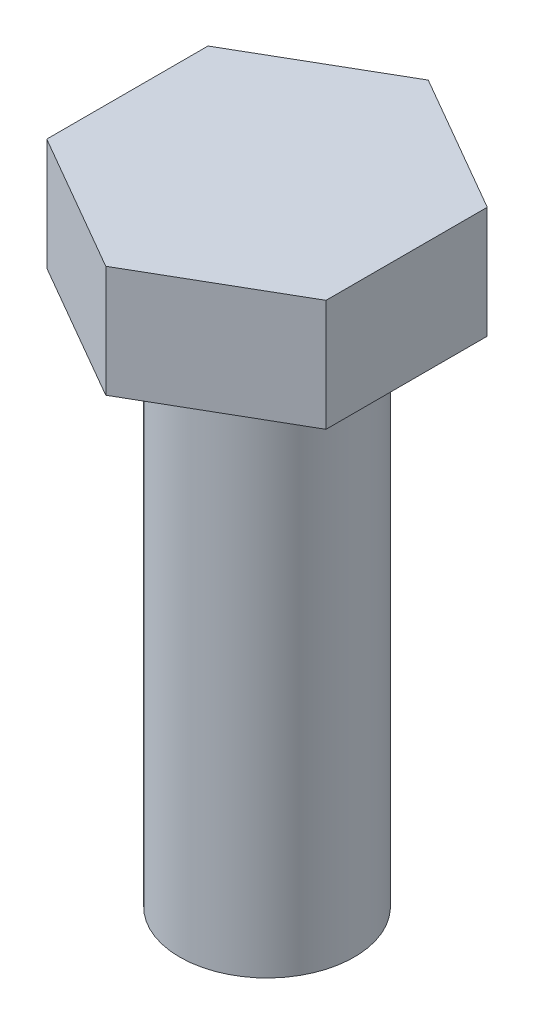
ISO-10303-21;
HEADER;
FILE_DESCRIPTION(('STEP AP214'),'2;1');
FILE_NAME('part.step','',(''),(''),'','','');
FILE_SCHEMA(('AUTOMOTIVE_DESIGN { 1 0 10303 214 1 1 1 1 }'));
ENDSEC;
DATA;
#1=APPLICATION_CONTEXT('core data for automotive mechanical design processes');
#2=APPLICATION_PROTOCOL_DEFINITION('international standard','automotive_design',2000,#1);
#3=PRODUCT_CONTEXT('',#1,'mechanical');
#4=PRODUCT('Part','Part','',(#3));
#5=PRODUCT_RELATED_PRODUCT_CATEGORY('part','',(#4));
#6=PRODUCT_DEFINITION_FORMATION('','',#4);
#7=PRODUCT_DEFINITION_CONTEXT('part definition',#1,'design');
#8=PRODUCT_DEFINITION('design','',#6,#7);
#9=PRODUCT_DEFINITION_SHAPE('','',#8);
#10=(LENGTH_UNIT() NAMED_UNIT(*) SI_UNIT(.MILLI.,.METRE.));
#11=(NAMED_UNIT(*) PLANE_ANGLE_UNIT() SI_UNIT($,.RADIAN.));
#12=(NAMED_UNIT(*) SI_UNIT($,.STERADIAN.) SOLID_ANGLE_UNIT());
#13=UNCERTAINTY_MEASURE_WITH_UNIT(LENGTH_MEASURE(1.E-05),#10,'distance_accuracy_value','');
#14=(GEOMETRIC_REPRESENTATION_CONTEXT(3) GLOBAL_UNCERTAINTY_ASSIGNED_CONTEXT((#13)) GLOBAL_UNIT_ASSIGNED_CONTEXT((#10,
#11,#12)) REPRESENTATION_CONTEXT('',''));
#15=CARTESIAN_POINT('',(0.,0.,0.));
#16=DIRECTION('',(0.,0.,1.));
#17=DIRECTION('',(1.,0.,0.));
#18=AXIS2_PLACEMENT_3D('',#15,#16,#17);
#19=CARTESIAN_POINT('',(7.99999999999995,6.4,-4.6188021535171));
#20=DIRECTION('',(-0.499999999999995,0.,0.866025403784441));
#21=DIRECTION('',(0.866025403784441,0.,0.499999999999995));
#22=AXIS2_PLACEMENT_3D('',#19,#20,#21);
#23=PLANE('',#22);
#24=DIRECTION('',(-0.866025403784441,0.,-0.499999999999995));
#25=VECTOR('',#24,1.);
#26=CARTESIAN_POINT('',(7.99999999999995,0.,-4.6188021535171));
#27=LINE('',#26,#25);
#28=CARTESIAN_POINT('',(7.99999999999995,0.,-4.6188021535171));
#29=VERTEX_POINT('',#28);
#30=CARTESIAN_POINT('',(0.,0.,-9.23760430703401));
#31=VERTEX_POINT('',#30);
#32=EDGE_CURVE('E121',#29,#31,#27,.T.);
#33=ORIENTED_EDGE('',*,*,#32,.T.);
#34=DIRECTION('',(0.,-1.,0.));
#35=VECTOR('',#34,1.);
#36=CARTESIAN_POINT('',(0.,6.4,-9.23760430703401));
#37=LINE('',#36,#35);
#38=CARTESIAN_POINT('',(0.,6.4,-9.23760430703401));
#39=VERTEX_POINT('',#38);
#40=EDGE_CURVE('E11',#39,#31,#37,.T.);
#41=ORIENTED_EDGE('',*,*,#40,.F.);
#42=DIRECTION('',(-0.866025403784441,0.,-0.499999999999995));
#43=VECTOR('',#42,1.);
#44=CARTESIAN_POINT('',(7.99999999999995,6.4,-4.6188021535171));
#45=LINE('',#44,#43);
#46=CARTESIAN_POINT('',(7.99999999999995,6.4,-4.6188021535171));
#47=VERTEX_POINT('',#46);
#48=EDGE_CURVE('E132',#47,#39,#45,.T.);
#49=ORIENTED_EDGE('',*,*,#48,.F.);
#50=DIRECTION('',(0.,-1.,0.));
#51=VECTOR('',#50,1.);
#52=CARTESIAN_POINT('',(7.99999999999995,6.4,-4.6188021535171));
#53=LINE('',#52,#51);
#54=EDGE_CURVE('E117',#47,#29,#53,.T.);
#55=ORIENTED_EDGE('',*,*,#54,.T.);
#56=EDGE_LOOP('',(#33,#41,#49,#55));
#57=FACE_BOUND('',#56,.T.);
#58=ADVANCED_FACE('F39',(#57),#23,.F.);
#59=CARTESIAN_POINT('',(0.,6.4,-9.23760430703401));
#60=DIRECTION('',(0.500000000000001,0.,0.866025403784438));
#61=DIRECTION('',(0.866025403784438,0.,-0.500000000000001));
#62=AXIS2_PLACEMENT_3D('',#59,#60,#61);
#63=PLANE('',#62);
#64=DIRECTION('',(-0.866025403784438,0.,0.500000000000001));
#65=VECTOR('',#64,1.);
#66=CARTESIAN_POINT('',(0.,0.,-9.23760430703401));
#67=LINE('',#66,#65);
#68=CARTESIAN_POINT('',(-8.00000000000001,0.,-4.61880215351699));
#69=VERTEX_POINT('',#68);
#70=EDGE_CURVE('E128',#31,#69,#67,.T.);
#71=ORIENTED_EDGE('',*,*,#70,.T.);
#72=DIRECTION('',(0.,-1.,0.));
#73=VECTOR('',#72,1.);
#74=CARTESIAN_POINT('',(-8.00000000000001,6.4,-4.61880215351699));
#75=LINE('',#74,#73);
#76=CARTESIAN_POINT('',(-8.00000000000001,6.4,-4.61880215351699));
#77=VERTEX_POINT('',#76);
#78=EDGE_CURVE('E50',#77,#69,#75,.T.);
#79=ORIENTED_EDGE('',*,*,#78,.F.);
#80=DIRECTION('',(-0.866025403784438,0.,0.500000000000001));
#81=VECTOR('',#80,1.);
#82=CARTESIAN_POINT('',(0.,6.4,-9.23760430703401));
#83=LINE('',#82,#81);
#84=EDGE_CURVE('E95',#39,#77,#83,.T.);
#85=ORIENTED_EDGE('',*,*,#84,.F.);
#86=ORIENTED_EDGE('',*,*,#40,.T.);
#87=EDGE_LOOP('',(#71,#79,#85,#86));
#88=FACE_BOUND('',#87,.T.);
#89=ADVANCED_FACE('F156',(#88),#63,.F.);
#90=CARTESIAN_POINT('',(-8.00000000000001,6.4,-4.61880215351699));
#91=DIRECTION('',(1.,0.,0.));
#92=DIRECTION('',(0.,0.,-1.));
#93=AXIS2_PLACEMENT_3D('',#90,#91,#92);
#94=PLANE('',#93);
#95=DIRECTION('',(0.,0.,1.));
#96=VECTOR('',#95,1.);
#97=CARTESIAN_POINT('',(-8.00000000000001,0.,-4.61880215351699));
#98=LINE('',#97,#96);
#99=CARTESIAN_POINT('',(-7.99999999999998,0.,4.61880215351704));
#100=VERTEX_POINT('',#99);
#101=EDGE_CURVE('E129',#69,#100,#98,.T.);
#102=ORIENTED_EDGE('',*,*,#101,.T.);
#103=DIRECTION('',(0.,-1.,0.));
#104=VECTOR('',#103,1.);
#105=CARTESIAN_POINT('',(-7.99999999999998,6.4,4.61880215351704));
#106=LINE('',#105,#104);
#107=CARTESIAN_POINT('',(-7.99999999999998,6.4,4.61880215351704));
#108=VERTEX_POINT('',#107);
#109=EDGE_CURVE('E114',#108,#100,#106,.T.);
#110=ORIENTED_EDGE('',*,*,#109,.F.);
#111=DIRECTION('',(0.,0.,1.));
#112=VECTOR('',#111,1.);
#113=CARTESIAN_POINT('',(-8.00000000000001,6.4,-4.61880215351699));
#114=LINE('',#113,#112);
#115=EDGE_CURVE('E103',#77,#108,#114,.T.);
#116=ORIENTED_EDGE('',*,*,#115,.F.);
#117=ORIENTED_EDGE('',*,*,#78,.T.);
#118=EDGE_LOOP('',(#102,#110,#116,#117));
#119=FACE_BOUND('',#118,.T.);
#120=ADVANCED_FACE('F139',(#119),#94,.F.);
#121=CARTESIAN_POINT('',(-7.99999999999998,6.4,4.61880215351704));
#122=DIRECTION('',(0.499999999999995,0.,-0.866025403784441));
#123=DIRECTION('',(-0.866025403784442,0.,-0.499999999999995));
#124=AXIS2_PLACEMENT_3D('',#121,#122,#123);
#125=PLANE('',#124);
#126=DIRECTION('',(0.866025403784441,0.,0.499999999999995));
#127=VECTOR('',#126,1.);
#128=CARTESIAN_POINT('',(-7.99999999999998,0.,4.61880215351704));
#129=LINE('',#128,#127);
#130=CARTESIAN_POINT('',(0.,0.,9.23760430703401));
#131=VERTEX_POINT('',#130);
#132=EDGE_CURVE('E111',#100,#131,#129,.T.);
#133=ORIENTED_EDGE('',*,*,#132,.T.);
#134=DIRECTION('',(0.,-1.,0.));
#135=VECTOR('',#134,1.);
#136=CARTESIAN_POINT('',(0.,6.4,9.23760430703401));
#137=LINE('',#136,#135);
#138=CARTESIAN_POINT('',(0.,6.4,9.23760430703401));
#139=VERTEX_POINT('',#138);
#140=EDGE_CURVE('E109',#139,#131,#137,.T.);
#141=ORIENTED_EDGE('',*,*,#140,.F.);
#142=DIRECTION('',(0.866025403784441,0.,0.499999999999995));
#143=VECTOR('',#142,1.);
#144=CARTESIAN_POINT('',(-7.99999999999998,6.4,4.61880215351704));
#145=LINE('',#144,#143);
#146=EDGE_CURVE('E98',#108,#139,#145,.T.);
#147=ORIENTED_EDGE('',*,*,#146,.F.);
#148=ORIENTED_EDGE('',*,*,#109,.T.);
#149=EDGE_LOOP('',(#133,#141,#147,#148));
#150=FACE_BOUND('',#149,.T.);
#151=ADVANCED_FACE('F112',(#150),#125,.F.);
#152=CARTESIAN_POINT('',(0.,6.4,9.23760430703401));
#153=DIRECTION('',(-0.500000000000007,0.,-0.866025403784435));
#154=DIRECTION('',(-0.866025403784435,0.,0.500000000000007));
#155=AXIS2_PLACEMENT_3D('',#152,#153,#154);
#156=PLANE('',#155);
#157=DIRECTION('',(0.866025403784435,0.,-0.500000000000007));
#158=VECTOR('',#157,1.);
#159=CARTESIAN_POINT('',(0.,0.,9.23760430703401));
#160=LINE('',#159,#158);
#161=CARTESIAN_POINT('',(8.00000000000004,0.,4.61880215351693));
#162=VERTEX_POINT('',#161);
#163=EDGE_CURVE('E76',#131,#162,#160,.T.);
#164=ORIENTED_EDGE('',*,*,#163,.T.);
#165=DIRECTION('',(0.,-1.,0.));
#166=VECTOR('',#165,1.);
#167=CARTESIAN_POINT('',(8.00000000000004,6.4,4.61880215351693));
#168=LINE('',#167,#166);
#169=CARTESIAN_POINT('',(8.00000000000004,6.4,4.61880215351693));
#170=VERTEX_POINT('',#169);
#171=EDGE_CURVE('E113',#170,#162,#168,.T.);
#172=ORIENTED_EDGE('',*,*,#171,.F.);
#173=DIRECTION('',(0.866025403784435,0.,-0.500000000000007));
#174=VECTOR('',#173,1.);
#175=CARTESIAN_POINT('',(0.,6.4,9.23760430703401));
#176=LINE('',#175,#174);
#177=EDGE_CURVE('E104',#139,#170,#176,.T.);
#178=ORIENTED_EDGE('',*,*,#177,.F.);
#179=ORIENTED_EDGE('',*,*,#140,.T.);
#180=EDGE_LOOP('',(#164,#172,#178,#179));
#181=FACE_BOUND('',#180,.T.);
#182=ADVANCED_FACE('F120',(#181),#156,.F.);
#183=CARTESIAN_POINT('',(8.00000000000004,6.4,4.61880215351693));
#184=DIRECTION('',(-1.,0.,0.));
#185=DIRECTION('',(0.,0.,1.));
#186=AXIS2_PLACEMENT_3D('',#183,#184,#185);
#187=PLANE('',#186);
#188=DIRECTION('',(0.,0.,-1.));
#189=VECTOR('',#188,1.);
#190=CARTESIAN_POINT('',(8.00000000000004,0.,4.61880215351693));
#191=LINE('',#190,#189);
#192=EDGE_CURVE('E84',#162,#29,#191,.T.);
#193=ORIENTED_EDGE('',*,*,#192,.T.);
#194=ORIENTED_EDGE('',*,*,#54,.F.);
#195=DIRECTION('',(0.,0.,-1.));
#196=VECTOR('',#195,1.);
#197=CARTESIAN_POINT('',(8.00000000000004,6.4,4.61880215351693));
#198=LINE('',#197,#196);
#199=EDGE_CURVE('E54',#170,#47,#198,.T.);
#200=ORIENTED_EDGE('',*,*,#199,.F.);
#201=ORIENTED_EDGE('',*,*,#171,.T.);
#202=EDGE_LOOP('',(#193,#194,#200,#201));
#203=FACE_BOUND('',#202,.T.);
#204=ADVANCED_FACE('F150',(#203),#187,.F.);
#205=CARTESIAN_POINT('',(0.,6.4,0.));
#206=DIRECTION('',(0.,1.,0.));
#207=DIRECTION('',(0.,0.,1.));
#208=AXIS2_PLACEMENT_3D('',#205,#206,#207);
#209=PLANE('',#208);
#210=ORIENTED_EDGE('',*,*,#48,.T.);
#211=ORIENTED_EDGE('',*,*,#84,.T.);
#212=ORIENTED_EDGE('',*,*,#115,.T.);
#213=ORIENTED_EDGE('',*,*,#146,.T.);
#214=ORIENTED_EDGE('',*,*,#177,.T.);
#215=ORIENTED_EDGE('',*,*,#199,.T.);
#216=EDGE_LOOP('',(#210,#211,#212,#213,#214,#215));
#217=FACE_BOUND('',#216,.T.);
#218=ADVANCED_FACE('F102',(#217),#209,.T.);
#219=CARTESIAN_POINT('',(0.,0.,0.));
#220=DIRECTION('',(0.,1.,0.));
#221=DIRECTION('',(0.,0.,1.));
#222=AXIS2_PLACEMENT_3D('',#219,#220,#221);
#223=PLANE('',#222);
#224=CARTESIAN_POINT('',(0.,0.,0.));
#225=DIRECTION('',(0.,1.,0.));
#226=DIRECTION('',(0.,0.,1.));
#227=AXIS2_PLACEMENT_3D('',#224,#225,#226);
#228=CIRCLE('',#227,5.);
#229=CARTESIAN_POINT('',(0.,0.,5.));
#230=VERTEX_POINT('',#229);
#231=EDGE_CURVE('E221',#230,#230,#228,.T.);
#232=ORIENTED_EDGE('',*,*,#231,.T.);
#233=EDGE_LOOP('',(#232));
#234=FACE_BOUND('',#233,.T.);
#235=ORIENTED_EDGE('',*,*,#32,.F.);
#236=ORIENTED_EDGE('',*,*,#192,.F.);
#237=ORIENTED_EDGE('',*,*,#163,.F.);
#238=ORIENTED_EDGE('',*,*,#132,.F.);
#239=ORIENTED_EDGE('',*,*,#101,.F.);
#240=ORIENTED_EDGE('',*,*,#70,.F.);
#241=EDGE_LOOP('',(#235,#236,#237,#238,#239,#240));
#242=FACE_BOUND('',#241,.T.);
#243=ADVANCED_FACE('F142',(#234,#242),#223,.F.);
#244=CARTESIAN_POINT('',(0.,-30.,0.));
#245=DIRECTION('',(0.,1.,0.));
#246=DIRECTION('',(0.,0.,1.));
#247=AXIS2_PLACEMENT_3D('',#244,#245,#246);
#248=CYLINDRICAL_SURFACE('',#247,5.);
#249=CARTESIAN_POINT('',(0.,-30.,0.));
#250=DIRECTION('',(0.,1.,0.));
#251=DIRECTION('',(0.,0.,1.));
#252=AXIS2_PLACEMENT_3D('',#249,#250,#251);
#253=CIRCLE('',#252,5.);
#254=CARTESIAN_POINT('',(0.,-30.,5.));
#255=VERTEX_POINT('',#254);
#256=EDGE_CURVE('E130',#255,#255,#253,.T.);
#257=ORIENTED_EDGE('',*,*,#256,.T.);
#258=EDGE_LOOP('',(#257));
#259=FACE_BOUND('',#258,.T.);
#260=ORIENTED_EDGE('',*,*,#231,.F.);
#261=EDGE_LOOP('',(#260));
#262=FACE_BOUND('',#261,.T.);
#263=ADVANCED_FACE('F200',(#259,#262),#248,.T.);
#264=CARTESIAN_POINT('',(0.,-30.,0.));
#265=DIRECTION('',(0.,1.,0.));
#266=DIRECTION('',(0.,0.,1.));
#267=AXIS2_PLACEMENT_3D('',#264,#265,#266);
#268=PLANE('',#267);
#269=ORIENTED_EDGE('',*,*,#256,.F.);
#270=EDGE_LOOP('',(#269));
#271=FACE_BOUND('',#270,.T.);
#272=ADVANCED_FACE('F208',(#271),#268,.F.);
#273=CLOSED_SHELL('',(#58,#89,#120,#151,#182,#204,#218,#243,#263,#272));
#274=MANIFOLD_SOLID_BREP('B2',#273);
#275=ADVANCED_BREP_SHAPE_REPRESENTATION('',(#18,#274),#14);
#276=SHAPE_DEFINITION_REPRESENTATION(#9,#275);
ENDSEC;
END-ISO-10303-21;
